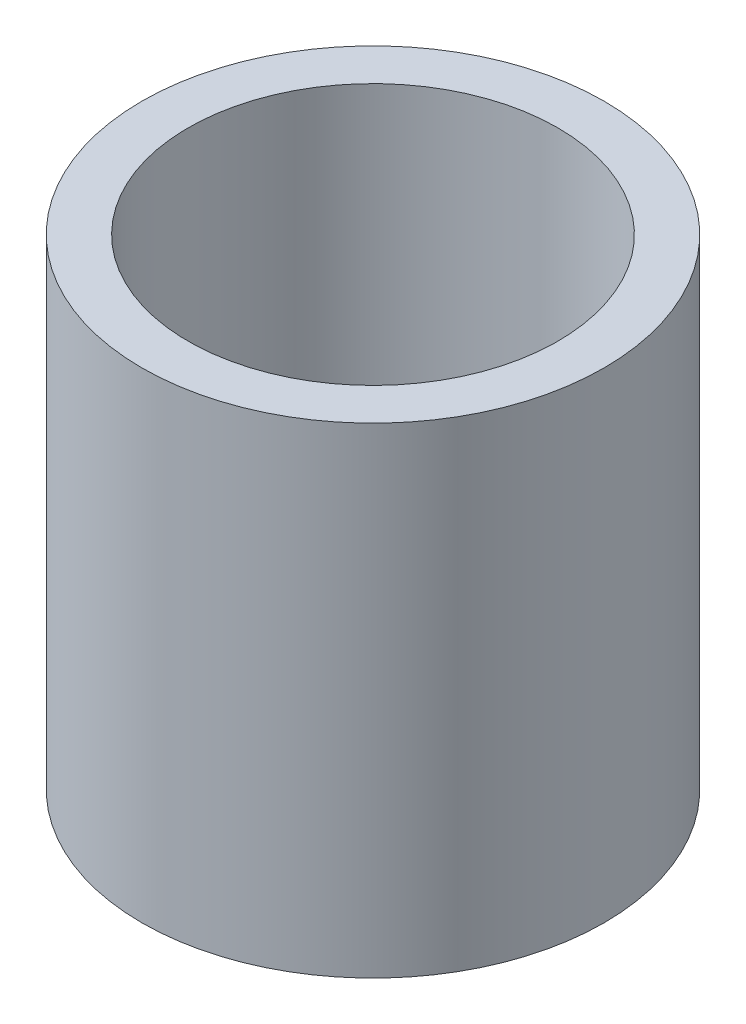
ISO-10303-21;
HEADER;
FILE_DESCRIPTION(('STEP AP214'),'2;1');
FILE_NAME('part.step','',(''),(''),'','','');
FILE_SCHEMA(('AUTOMOTIVE_DESIGN { 1 0 10303 214 1 1 1 1 }'));
ENDSEC;
DATA;
#1=APPLICATION_CONTEXT('core data for automotive mechanical design processes');
#2=APPLICATION_PROTOCOL_DEFINITION('international standard','automotive_design',2000,#1);
#3=PRODUCT_CONTEXT('',#1,'mechanical');
#4=PRODUCT('Part','Part','',(#3));
#5=PRODUCT_RELATED_PRODUCT_CATEGORY('part','',(#4));
#6=PRODUCT_DEFINITION_FORMATION('','',#4);
#7=PRODUCT_DEFINITION_CONTEXT('part definition',#1,'design');
#8=PRODUCT_DEFINITION('design','',#6,#7);
#9=PRODUCT_DEFINITION_SHAPE('','',#8);
#10=(LENGTH_UNIT() NAMED_UNIT(*) SI_UNIT(.MILLI.,.METRE.));
#11=(NAMED_UNIT(*) PLANE_ANGLE_UNIT() SI_UNIT($,.RADIAN.));
#12=(NAMED_UNIT(*) SI_UNIT($,.STERADIAN.) SOLID_ANGLE_UNIT());
#13=UNCERTAINTY_MEASURE_WITH_UNIT(LENGTH_MEASURE(1.E-05),#10,'distance_accuracy_value','');
#14=(GEOMETRIC_REPRESENTATION_CONTEXT(3) GLOBAL_UNCERTAINTY_ASSIGNED_CONTEXT((#13)) GLOBAL_UNIT_ASSIGNED_CONTEXT((#10,
#11,#12)) REPRESENTATION_CONTEXT('',''));
#15=CARTESIAN_POINT('',(0.,0.,0.));
#16=DIRECTION('',(0.,0.,1.));
#17=DIRECTION('',(1.,0.,0.));
#18=AXIS2_PLACEMENT_3D('',#15,#16,#17);
#19=CARTESIAN_POINT('',(0.,6.604,0.));
#20=DIRECTION('',(0.,1.,0.));
#21=DIRECTION('',(0.,0.,1.));
#22=AXIS2_PLACEMENT_3D('',#19,#20,#21);
#23=PLANE('',#22);
#24=CARTESIAN_POINT('',(0.,6.604,0.));
#25=DIRECTION('',(0.,1.,0.));
#26=DIRECTION('',(0.,0.,1.));
#27=AXIS2_PLACEMENT_3D('',#24,#25,#26);
#28=CIRCLE('',#27,3.175);
#29=CARTESIAN_POINT('',(0.,6.604,-3.175));
#30=VERTEX_POINT('',#29);
#31=EDGE_CURVE('E10',#30,#30,#28,.T.);
#32=ORIENTED_EDGE('',*,*,#31,.T.);
#33=EDGE_LOOP('',(#32));
#34=FACE_BOUND('',#33,.T.);
#35=CARTESIAN_POINT('',(0.,6.604,0.));
#36=DIRECTION('',(0.,1.,0.));
#37=DIRECTION('',(0.,0.,1.));
#38=AXIS2_PLACEMENT_3D('',#35,#36,#37);
#39=CIRCLE('',#38,2.54);
#40=CARTESIAN_POINT('',(0.,6.604,-2.54));
#41=VERTEX_POINT('',#40);
#42=EDGE_CURVE('E46',#41,#41,#39,.T.);
#43=ORIENTED_EDGE('',*,*,#42,.F.);
#44=EDGE_LOOP('',(#43));
#45=FACE_BOUND('',#44,.T.);
#46=ADVANCED_FACE('F35',(#34,#45),#23,.T.);
#47=CARTESIAN_POINT('',(0.,0.,0.));
#48=DIRECTION('',(0.,1.,0.));
#49=DIRECTION('',(0.,0.,1.));
#50=AXIS2_PLACEMENT_3D('',#47,#48,#49);
#51=PLANE('',#50);
#52=CARTESIAN_POINT('',(0.,0.,0.));
#53=DIRECTION('',(0.,1.,0.));
#54=DIRECTION('',(0.,0.,1.));
#55=AXIS2_PLACEMENT_3D('',#52,#53,#54);
#56=CIRCLE('',#55,3.175);
#57=CARTESIAN_POINT('',(0.,0.,-3.175));
#58=VERTEX_POINT('',#57);
#59=EDGE_CURVE('E39',#58,#58,#56,.T.);
#60=ORIENTED_EDGE('',*,*,#59,.F.);
#61=EDGE_LOOP('',(#60));
#62=FACE_BOUND('',#61,.T.);
#63=CARTESIAN_POINT('',(0.,0.,0.));
#64=DIRECTION('',(0.,1.,0.));
#65=DIRECTION('',(0.,0.,1.));
#66=AXIS2_PLACEMENT_3D('',#63,#64,#65);
#67=CIRCLE('',#66,2.54);
#68=CARTESIAN_POINT('',(0.,0.,-2.54));
#69=VERTEX_POINT('',#68);
#70=EDGE_CURVE('E48',#69,#69,#67,.T.);
#71=ORIENTED_EDGE('',*,*,#70,.T.);
#72=EDGE_LOOP('',(#71));
#73=FACE_BOUND('',#72,.T.);
#74=ADVANCED_FACE('F58',(#62,#73),#51,.F.);
#75=CARTESIAN_POINT('',(0.,6.604,0.));
#76=DIRECTION('',(0.,-1.,0.));
#77=DIRECTION('',(0.,0.,-1.));
#78=AXIS2_PLACEMENT_3D('',#75,#76,#77);
#79=CYLINDRICAL_SURFACE('',#78,3.175);
#80=CARTESIAN_POINT('',(0.,6.604,-3.175));
#81=CARTESIAN_POINT('',(0.,6.53520833333333,-3.175));
#82=CARTESIAN_POINT('',(0.,6.46641666666667,-3.175));
#83=CARTESIAN_POINT('',(0.,6.32883333333333,-3.175));
#84=CARTESIAN_POINT('',(0.,6.26004166666667,-3.175));
#85=CARTESIAN_POINT('',(0.,6.12245833333333,-3.175));
#86=CARTESIAN_POINT('',(0.,6.05366666666667,-3.175));
#87=CARTESIAN_POINT('',(0.,5.91608333333333,-3.175));
#88=CARTESIAN_POINT('',(0.,5.84729166666667,-3.175));
#89=CARTESIAN_POINT('',(0.,5.70970833333333,-3.175));
#90=CARTESIAN_POINT('',(0.,5.64091666666667,-3.175));
#91=CARTESIAN_POINT('',(0.,5.50333333333333,-3.175));
#92=CARTESIAN_POINT('',(0.,5.43454166666667,-3.175));
#93=CARTESIAN_POINT('',(0.,5.29695833333333,-3.175));
#94=CARTESIAN_POINT('',(0.,5.22816666666667,-3.175));
#95=CARTESIAN_POINT('',(0.,5.09058333333333,-3.175));
#96=CARTESIAN_POINT('',(0.,5.02179166666667,-3.175));
#97=CARTESIAN_POINT('',(0.,4.88420833333333,-3.175));
#98=CARTESIAN_POINT('',(0.,4.81541666666667,-3.175));
#99=CARTESIAN_POINT('',(0.,4.67783333333333,-3.175));
#100=CARTESIAN_POINT('',(0.,4.60904166666667,-3.175));
#101=CARTESIAN_POINT('',(0.,4.47145833333333,-3.175));
#102=CARTESIAN_POINT('',(0.,4.40266666666667,-3.175));
#103=CARTESIAN_POINT('',(0.,4.26508333333333,-3.175));
#104=CARTESIAN_POINT('',(0.,4.19629166666667,-3.175));
#105=CARTESIAN_POINT('',(0.,4.05870833333333,-3.175));
#106=CARTESIAN_POINT('',(0.,3.98991666666667,-3.175));
#107=CARTESIAN_POINT('',(0.,3.85233333333333,-3.175));
#108=CARTESIAN_POINT('',(0.,3.78354166666667,-3.175));
#109=CARTESIAN_POINT('',(0.,3.64595833333333,-3.175));
#110=CARTESIAN_POINT('',(0.,3.57716666666667,-3.175));
#111=CARTESIAN_POINT('',(0.,3.43958333333333,-3.175));
#112=CARTESIAN_POINT('',(0.,3.37079166666667,-3.175));
#113=CARTESIAN_POINT('',(0.,3.23320833333333,-3.175));
#114=CARTESIAN_POINT('',(0.,3.16441666666667,-3.175));
#115=CARTESIAN_POINT('',(0.,3.02683333333333,-3.175));
#116=CARTESIAN_POINT('',(0.,2.95804166666667,-3.175));
#117=CARTESIAN_POINT('',(0.,2.82045833333333,-3.175));
#118=CARTESIAN_POINT('',(0.,2.75166666666667,-3.175));
#119=CARTESIAN_POINT('',(0.,2.61408333333333,-3.175));
#120=CARTESIAN_POINT('',(0.,2.54529166666667,-3.175));
#121=CARTESIAN_POINT('',(0.,2.40770833333333,-3.175));
#122=CARTESIAN_POINT('',(0.,2.33891666666667,-3.175));
#123=CARTESIAN_POINT('',(0.,2.20133333333333,-3.175));
#124=CARTESIAN_POINT('',(0.,2.13254166666667,-3.175));
#125=CARTESIAN_POINT('',(0.,1.99495833333333,-3.175));
#126=CARTESIAN_POINT('',(0.,1.92616666666667,-3.175));
#127=CARTESIAN_POINT('',(0.,1.78858333333333,-3.175));
#128=CARTESIAN_POINT('',(0.,1.71979166666667,-3.175));
#129=CARTESIAN_POINT('',(0.,1.58220833333333,-3.175));
#130=CARTESIAN_POINT('',(0.,1.51341666666667,-3.175));
#131=CARTESIAN_POINT('',(0.,1.37583333333333,-3.175));
#132=CARTESIAN_POINT('',(0.,1.30704166666667,-3.175));
#133=CARTESIAN_POINT('',(0.,1.16945833333333,-3.175));
#134=CARTESIAN_POINT('',(0.,1.10066666666667,-3.175));
#135=CARTESIAN_POINT('',(0.,0.963083333333333,-3.175));
#136=CARTESIAN_POINT('',(0.,0.894291666666666,-3.175));
#137=CARTESIAN_POINT('',(0.,0.756708333333333,-3.175));
#138=CARTESIAN_POINT('',(0.,0.687916666666667,-3.175));
#139=CARTESIAN_POINT('',(0.,0.550333333333333,-3.175));
#140=CARTESIAN_POINT('',(0.,0.481541666666667,-3.175));
#141=CARTESIAN_POINT('',(0.,0.343958333333333,-3.175));
#142=CARTESIAN_POINT('',(0.,0.275166666666667,-3.175));
#143=CARTESIAN_POINT('',(0.,0.137583333333333,-3.175));
#144=CARTESIAN_POINT('',(0.,0.0687916666666666,-3.175));
#145=CARTESIAN_POINT('',(0.,0.,-3.175));
#146=B_SPLINE_CURVE_WITH_KNOTS('',3,(#80,#81,#82,#83,#84,#85,#86,#87,#88,#89,#90,#91,#92,#93,
#94,#95,#96,#97,#98,#99,#100,#101,#102,#103,#104,#105,#106,#107,#108,#109,#110,#111,#112,#113,
#114,#115,#116,#117,#118,#119,#120,#121,#122,#123,#124,#125,#126,#127,#128,#129,#130,#131,#132,
#133,#134,#135,#136,#137,#138,#139,#140,#141,#142,#143,#144,#145),.UNSPECIFIED.,.F.,.F.,(4,2,2,
2,2,2,2,2,2,2,2,2,2,2,2,2,2,2,2,2,2,2,2,2,2,2,2,2,2,2,2,2,4),(0.,0.206375,0.41275,0.619125,
0.8255,1.031875,1.23825,1.444625,1.651,1.857375,2.06375,2.270125,2.4765,2.682875,2.88925,
3.095625,3.302,3.508375,3.71475,3.921125,4.1275,4.333875,4.54025,4.746625,4.953,5.159375,
5.36575,5.572125,5.7785,5.984875,6.19125,6.397625,6.604),.UNSPECIFIED.);
#147=EDGE_CURVE('BSEAM37',#30,#58,#146,.T.);
#148=ORIENTED_EDGE('',*,*,#31,.F.);
#149=ORIENTED_EDGE('',*,*,#59,.T.);
#150=ORIENTED_EDGE('',*,*,#147,.T.);
#151=ORIENTED_EDGE('',*,*,#147,.F.);
#152=EDGE_LOOP('',(#148,#150,#149,#151));
#153=FACE_BOUND('',#152,.T.);
#154=ADVANCED_FACE('F37',(#153),#79,.T.);
#155=CARTESIAN_POINT('',(0.,6.604,0.));
#156=DIRECTION('',(0.,-1.,0.));
#157=DIRECTION('',(0.,0.,-1.));
#158=AXIS2_PLACEMENT_3D('',#155,#156,#157);
#159=CYLINDRICAL_SURFACE('',#158,2.54);
#160=CARTESIAN_POINT('',(0.,6.604,-2.54));
#161=CARTESIAN_POINT('',(0.,6.53520833333333,-2.54));
#162=CARTESIAN_POINT('',(0.,6.46641666666667,-2.54));
#163=CARTESIAN_POINT('',(0.,6.32883333333333,-2.54));
#164=CARTESIAN_POINT('',(0.,6.26004166666667,-2.54));
#165=CARTESIAN_POINT('',(0.,6.12245833333333,-2.54));
#166=CARTESIAN_POINT('',(0.,6.05366666666667,-2.54));
#167=CARTESIAN_POINT('',(0.,5.91608333333333,-2.54));
#168=CARTESIAN_POINT('',(0.,5.84729166666667,-2.54));
#169=CARTESIAN_POINT('',(0.,5.70970833333333,-2.54));
#170=CARTESIAN_POINT('',(0.,5.64091666666667,-2.54));
#171=CARTESIAN_POINT('',(0.,5.50333333333333,-2.54));
#172=CARTESIAN_POINT('',(0.,5.43454166666667,-2.54));
#173=CARTESIAN_POINT('',(0.,5.29695833333333,-2.54));
#174=CARTESIAN_POINT('',(0.,5.22816666666667,-2.54));
#175=CARTESIAN_POINT('',(0.,5.09058333333333,-2.54));
#176=CARTESIAN_POINT('',(0.,5.02179166666667,-2.54));
#177=CARTESIAN_POINT('',(0.,4.88420833333333,-2.54));
#178=CARTESIAN_POINT('',(0.,4.81541666666667,-2.54));
#179=CARTESIAN_POINT('',(0.,4.67783333333333,-2.54));
#180=CARTESIAN_POINT('',(0.,4.60904166666667,-2.54));
#181=CARTESIAN_POINT('',(0.,4.47145833333333,-2.54));
#182=CARTESIAN_POINT('',(0.,4.40266666666667,-2.54));
#183=CARTESIAN_POINT('',(0.,4.26508333333333,-2.54));
#184=CARTESIAN_POINT('',(0.,4.19629166666667,-2.54));
#185=CARTESIAN_POINT('',(0.,4.05870833333333,-2.54));
#186=CARTESIAN_POINT('',(0.,3.98991666666667,-2.54));
#187=CARTESIAN_POINT('',(0.,3.85233333333333,-2.54));
#188=CARTESIAN_POINT('',(0.,3.78354166666667,-2.54));
#189=CARTESIAN_POINT('',(0.,3.64595833333333,-2.54));
#190=CARTESIAN_POINT('',(0.,3.57716666666667,-2.54));
#191=CARTESIAN_POINT('',(0.,3.43958333333333,-2.54));
#192=CARTESIAN_POINT('',(0.,3.37079166666667,-2.54));
#193=CARTESIAN_POINT('',(0.,3.23320833333333,-2.54));
#194=CARTESIAN_POINT('',(0.,3.16441666666667,-2.54));
#195=CARTESIAN_POINT('',(0.,3.02683333333333,-2.54));
#196=CARTESIAN_POINT('',(0.,2.95804166666667,-2.54));
#197=CARTESIAN_POINT('',(0.,2.82045833333333,-2.54));
#198=CARTESIAN_POINT('',(0.,2.75166666666667,-2.54));
#199=CARTESIAN_POINT('',(0.,2.61408333333333,-2.54));
#200=CARTESIAN_POINT('',(0.,2.54529166666667,-2.54));
#201=CARTESIAN_POINT('',(0.,2.40770833333333,-2.54));
#202=CARTESIAN_POINT('',(0.,2.33891666666667,-2.54));
#203=CARTESIAN_POINT('',(0.,2.20133333333333,-2.54));
#204=CARTESIAN_POINT('',(0.,2.13254166666667,-2.54));
#205=CARTESIAN_POINT('',(0.,1.99495833333333,-2.54));
#206=CARTESIAN_POINT('',(0.,1.92616666666667,-2.54));
#207=CARTESIAN_POINT('',(0.,1.78858333333333,-2.54));
#208=CARTESIAN_POINT('',(0.,1.71979166666667,-2.54));
#209=CARTESIAN_POINT('',(0.,1.58220833333333,-2.54));
#210=CARTESIAN_POINT('',(0.,1.51341666666667,-2.54));
#211=CARTESIAN_POINT('',(0.,1.37583333333333,-2.54));
#212=CARTESIAN_POINT('',(0.,1.30704166666667,-2.54));
#213=CARTESIAN_POINT('',(0.,1.16945833333333,-2.54));
#214=CARTESIAN_POINT('',(0.,1.10066666666667,-2.54));
#215=CARTESIAN_POINT('',(0.,0.963083333333333,-2.54));
#216=CARTESIAN_POINT('',(0.,0.894291666666666,-2.54));
#217=CARTESIAN_POINT('',(0.,0.756708333333333,-2.54));
#218=CARTESIAN_POINT('',(0.,0.687916666666667,-2.54));
#219=CARTESIAN_POINT('',(0.,0.550333333333333,-2.54));
#220=CARTESIAN_POINT('',(0.,0.481541666666667,-2.54));
#221=CARTESIAN_POINT('',(0.,0.343958333333333,-2.54));
#222=CARTESIAN_POINT('',(0.,0.275166666666667,-2.54));
#223=CARTESIAN_POINT('',(0.,0.137583333333333,-2.54));
#224=CARTESIAN_POINT('',(0.,0.0687916666666666,-2.54));
#225=CARTESIAN_POINT('',(0.,0.,-2.54));
#226=B_SPLINE_CURVE_WITH_KNOTS('',3,(#160,#161,#162,#163,#164,#165,#166,#167,#168,#169,#170,
#171,#172,#173,#174,#175,#176,#177,#178,#179,#180,#181,#182,#183,#184,#185,#186,#187,#188,#189,
#190,#191,#192,#193,#194,#195,#196,#197,#198,#199,#200,#201,#202,#203,#204,#205,#206,#207,#208,
#209,#210,#211,#212,#213,#214,#215,#216,#217,#218,#219,#220,#221,#222,#223,#224,#225),
.UNSPECIFIED.,.F.,.F.,(4,2,2,2,2,2,2,2,2,2,2,2,2,2,2,2,2,2,2,2,2,2,2,2,2,2,2,2,2,2,2,2,4),(0.,
0.206375,0.41275,0.619125,0.8255,1.031875,1.23825,1.444625,1.651,1.857375,2.06375,2.270125,
2.4765,2.682875,2.88925,3.095625,3.302,3.508375,3.71475,3.921125,4.1275,4.333875,4.54025,
4.746625,4.953,5.159375,5.36575,5.572125,5.7785,5.984875,6.19125,6.397625,6.604),.UNSPECIFIED.);
#227=EDGE_CURVE('BSEAM54',#41,#69,#226,.T.);
#228=ORIENTED_EDGE('',*,*,#42,.T.);
#229=ORIENTED_EDGE('',*,*,#70,.F.);
#230=ORIENTED_EDGE('',*,*,#227,.T.);
#231=ORIENTED_EDGE('',*,*,#227,.F.);
#232=EDGE_LOOP('',(#228,#230,#229,#231));
#233=FACE_BOUND('',#232,.T.);
#234=ADVANCED_FACE('F54',(#233),#159,.F.);
#235=CLOSED_SHELL('',(#46,#74,#154,#234));
#236=MANIFOLD_SOLID_BREP('B2',#235);
#237=ADVANCED_BREP_SHAPE_REPRESENTATION('',(#18,#236),#14);
#238=SHAPE_DEFINITION_REPRESENTATION(#9,#237);
ENDSEC;
END-ISO-10303-21;
